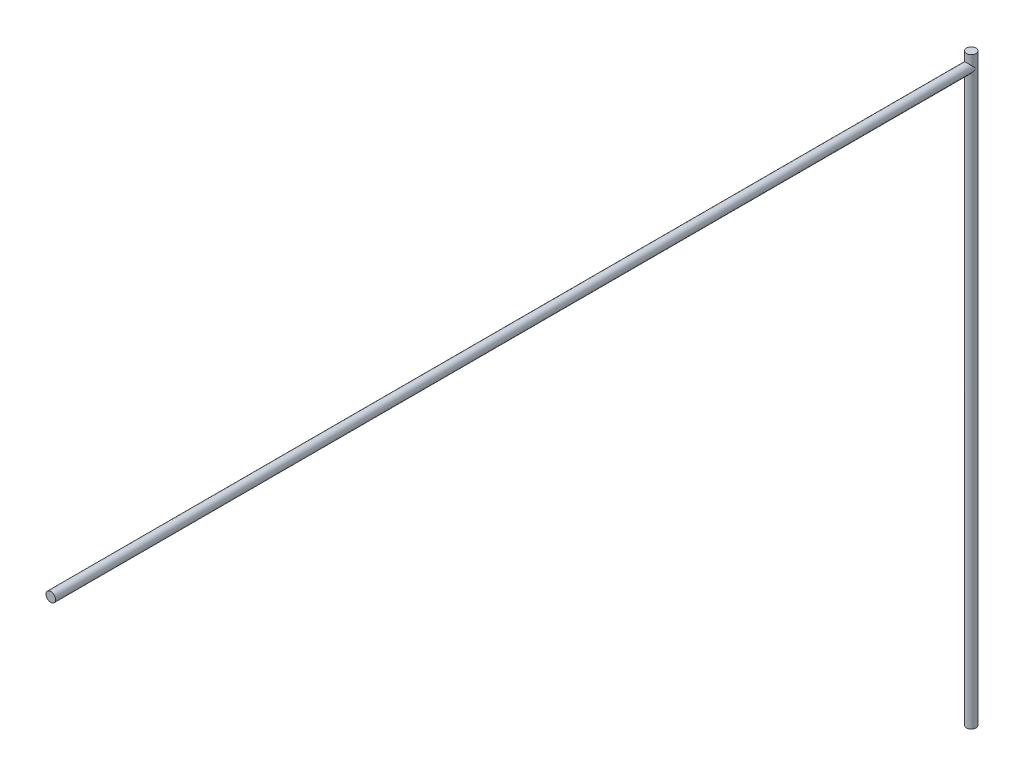
ISO-10303-21;
HEADER;
FILE_DESCRIPTION(('STEP AP214'),'2;1');
FILE_NAME('part.step','',(''),(''),'','','');
FILE_SCHEMA(('AUTOMOTIVE_DESIGN { 1 0 10303 214 1 1 1 1 }'));
ENDSEC;
DATA;
#1=APPLICATION_CONTEXT('core data for automotive mechanical design processes');
#2=APPLICATION_PROTOCOL_DEFINITION('international standard','automotive_design',2000,#1);
#3=PRODUCT_CONTEXT('',#1,'mechanical');
#4=PRODUCT('Part','Part','',(#3));
#5=PRODUCT_RELATED_PRODUCT_CATEGORY('part','',(#4));
#6=PRODUCT_DEFINITION_FORMATION('','',#4);
#7=PRODUCT_DEFINITION_CONTEXT('part definition',#1,'design');
#8=PRODUCT_DEFINITION('design','',#6,#7);
#9=PRODUCT_DEFINITION_SHAPE('','',#8);
#10=(LENGTH_UNIT() NAMED_UNIT(*) SI_UNIT(.MILLI.,.METRE.));
#11=(NAMED_UNIT(*) PLANE_ANGLE_UNIT() SI_UNIT($,.RADIAN.));
#12=(NAMED_UNIT(*) SI_UNIT($,.STERADIAN.) SOLID_ANGLE_UNIT());
#13=UNCERTAINTY_MEASURE_WITH_UNIT(LENGTH_MEASURE(1.E-05),#10,'distance_accuracy_value','');
#14=(GEOMETRIC_REPRESENTATION_CONTEXT(3) GLOBAL_UNCERTAINTY_ASSIGNED_CONTEXT((#13)) GLOBAL_UNIT_ASSIGNED_CONTEXT((#10,
#11,#12)) REPRESENTATION_CONTEXT('',''));
#15=CARTESIAN_POINT('',(0.,0.,0.));
#16=DIRECTION('',(0.,0.,1.));
#17=DIRECTION('',(1.,0.,0.));
#18=AXIS2_PLACEMENT_3D('',#15,#16,#17);
#19=CARTESIAN_POINT('',(0.,0.,145.));
#20=DIRECTION('',(0.,0.,-1.));
#21=DIRECTION('',(-1.,0.,0.));
#22=AXIS2_PLACEMENT_3D('',#19,#20,#21);
#23=CYLINDRICAL_SURFACE('',#22,0.75);
#24=CARTESIAN_POINT('',(0.,0.,145.));
#25=DIRECTION('',(0.,0.,1.));
#26=DIRECTION('',(1.,0.,0.));
#27=AXIS2_PLACEMENT_3D('',#24,#25,#26);
#28=CIRCLE('',#27,0.75);
#29=CARTESIAN_POINT('',(0.75,0.,145.));
#30=VERTEX_POINT('',#29);
#31=EDGE_CURVE('E11',#30,#30,#28,.T.);
#32=ORIENTED_EDGE('',*,*,#31,.F.);
#33=EDGE_LOOP('',(#32));
#34=FACE_BOUND('',#33,.T.);
#35=CARTESIAN_POINT('',(0.,0.,0.));
#36=DIRECTION('',(0.,-0.707106781186547,-0.707106781186547));
#37=DIRECTION('',(0.,0.707106781186547,-0.707106781186547));
#38=AXIS2_PLACEMENT_3D('',#35,#36,#37);
#39=ELLIPSE('',#38,1.06066017177982,0.75);
#40=CARTESIAN_POINT('',(0.75,0.,0.));
#41=VERTEX_POINT('',#40);
#42=CARTESIAN_POINT('',(-0.75,0.,0.));
#43=VERTEX_POINT('',#42);
#44=EDGE_CURVE('E42',#41,#43,#39,.T.);
#45=ORIENTED_EDGE('',*,*,#44,.F.);
#46=CARTESIAN_POINT('',(0.,0.,0.));
#47=DIRECTION('',(0.,0.707106781186547,-0.707106781186547));
#48=DIRECTION('',(0.,-0.707106781186547,-0.707106781186547));
#49=AXIS2_PLACEMENT_3D('',#46,#47,#48);
#50=ELLIPSE('',#49,1.06066017177982,0.75);
#51=EDGE_CURVE('E48',#43,#41,#50,.T.);
#52=ORIENTED_EDGE('',*,*,#51,.F.);
#53=EDGE_LOOP('',(#45,#52));
#54=FACE_BOUND('',#53,.T.);
#55=ADVANCED_FACE('F35',(#34,#54),#23,.T.);
#56=CARTESIAN_POINT('',(0.,0.,145.));
#57=DIRECTION('',(0.,0.,1.));
#58=DIRECTION('',(1.,0.,0.));
#59=AXIS2_PLACEMENT_3D('',#56,#57,#58);
#60=PLANE('',#59);
#61=ORIENTED_EDGE('',*,*,#31,.T.);
#62=EDGE_LOOP('',(#61));
#63=FACE_BOUND('',#62,.T.);
#64=ADVANCED_FACE('F72',(#63),#60,.T.);
#65=CARTESIAN_POINT('',(0.,2.,0.));
#66=DIRECTION('',(0.,-1.,0.));
#67=DIRECTION('',(0.,0.,-1.));
#68=AXIS2_PLACEMENT_3D('',#65,#66,#67);
#69=CYLINDRICAL_SURFACE('',#68,0.75);
#70=CARTESIAN_POINT('',(0.,2.,0.));
#71=DIRECTION('',(0.,1.,0.));
#72=DIRECTION('',(0.,0.,1.));
#73=AXIS2_PLACEMENT_3D('',#70,#71,#72);
#74=CIRCLE('',#73,0.75);
#75=CARTESIAN_POINT('',(0.,2.,0.75));
#76=VERTEX_POINT('',#75);
#77=EDGE_CURVE('E52',#76,#76,#74,.T.);
#78=ORIENTED_EDGE('',*,*,#77,.F.);
#79=EDGE_LOOP('',(#78));
#80=FACE_BOUND('',#79,.T.);
#81=CARTESIAN_POINT('',(0.,-90.,0.));
#82=DIRECTION('',(0.,1.,0.));
#83=DIRECTION('',(0.,0.,1.));
#84=AXIS2_PLACEMENT_3D('',#81,#82,#83);
#85=CIRCLE('',#84,0.75);
#86=CARTESIAN_POINT('',(0.,-90.,0.75));
#87=VERTEX_POINT('',#86);
#88=EDGE_CURVE('E55',#87,#87,#85,.T.);
#89=ORIENTED_EDGE('',*,*,#88,.T.);
#90=EDGE_LOOP('',(#89));
#91=FACE_BOUND('',#90,.T.);
#92=ORIENTED_EDGE('',*,*,#51,.T.);
#93=ORIENTED_EDGE('',*,*,#44,.T.);
#94=EDGE_LOOP('',(#92,#93));
#95=FACE_BOUND('',#94,.T.);
#96=ADVANCED_FACE('F51',(#80,#91,#95),#69,.T.);
#97=CARTESIAN_POINT('',(0.,2.,0.));
#98=DIRECTION('',(0.,1.,0.));
#99=DIRECTION('',(0.,0.,1.));
#100=AXIS2_PLACEMENT_3D('',#97,#98,#99);
#101=PLANE('',#100);
#102=ORIENTED_EDGE('',*,*,#77,.T.);
#103=EDGE_LOOP('',(#102));
#104=FACE_BOUND('',#103,.T.);
#105=ADVANCED_FACE('F64',(#104),#101,.T.);
#106=CARTESIAN_POINT('',(0.,-90.,0.));
#107=DIRECTION('',(0.,1.,0.));
#108=DIRECTION('',(0.,0.,1.));
#109=AXIS2_PLACEMENT_3D('',#106,#107,#108);
#110=PLANE('',#109);
#111=ORIENTED_EDGE('',*,*,#88,.F.);
#112=EDGE_LOOP('',(#111));
#113=FACE_BOUND('',#112,.T.);
#114=ADVANCED_FACE('F62',(#113),#110,.F.);
#115=CLOSED_SHELL('',(#55,#64,#96,#105,#114));
#116=MANIFOLD_SOLID_BREP('B2',#115);
#117=ADVANCED_BREP_SHAPE_REPRESENTATION('',(#18,#116),#14);
#118=SHAPE_DEFINITION_REPRESENTATION(#9,#117);
ENDSEC;
END-ISO-10303-21;
